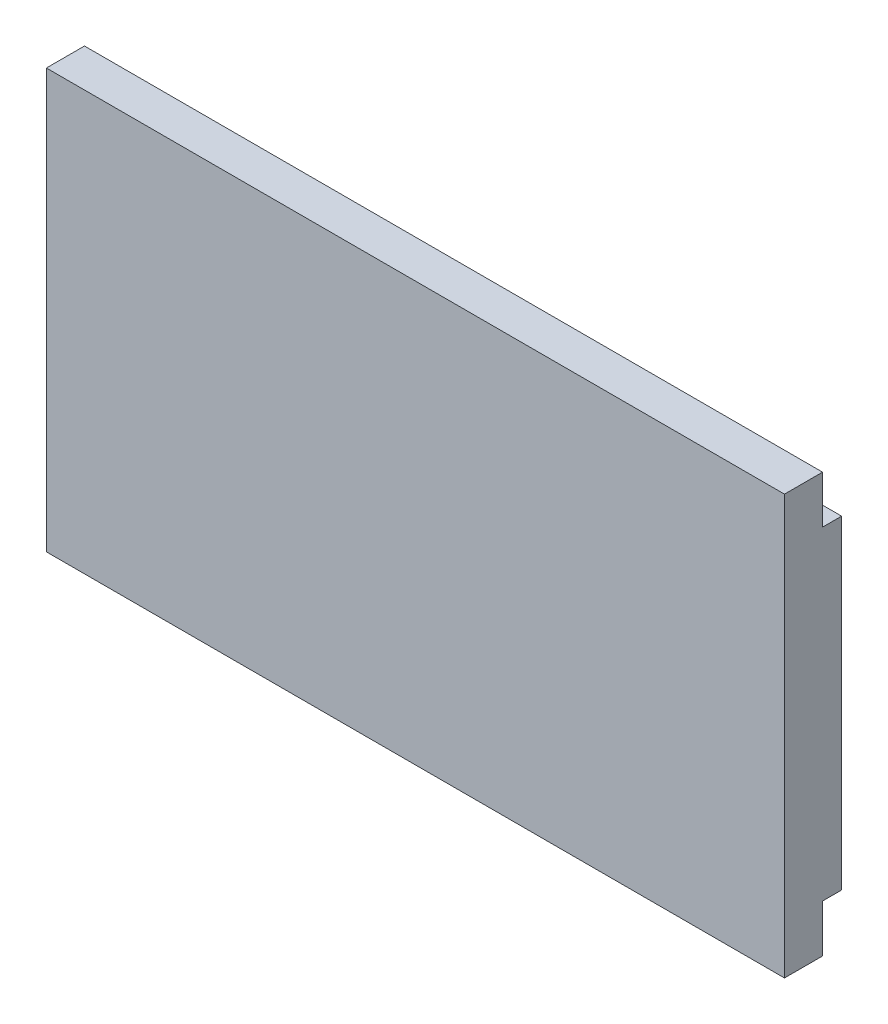
ISO-10303-21;
HEADER;
FILE_DESCRIPTION(('STEP AP214'),'2;1');
FILE_NAME('part.step','',(''),(''),'','','');
FILE_SCHEMA(('AUTOMOTIVE_DESIGN { 1 0 10303 214 1 1 1 1 }'));
ENDSEC;
DATA;
#1=APPLICATION_CONTEXT('core data for automotive mechanical design processes');
#2=APPLICATION_PROTOCOL_DEFINITION('international standard','automotive_design',2000,#1);
#3=PRODUCT_CONTEXT('',#1,'mechanical');
#4=PRODUCT('Part','Part','',(#3));
#5=PRODUCT_RELATED_PRODUCT_CATEGORY('part','',(#4));
#6=PRODUCT_DEFINITION_FORMATION('','',#4);
#7=PRODUCT_DEFINITION_CONTEXT('part definition',#1,'design');
#8=PRODUCT_DEFINITION('design','',#6,#7);
#9=PRODUCT_DEFINITION_SHAPE('','',#8);
#10=(LENGTH_UNIT() NAMED_UNIT(*) SI_UNIT(.MILLI.,.METRE.));
#11=(NAMED_UNIT(*) PLANE_ANGLE_UNIT() SI_UNIT($,.RADIAN.));
#12=(NAMED_UNIT(*) SI_UNIT($,.STERADIAN.) SOLID_ANGLE_UNIT());
#13=UNCERTAINTY_MEASURE_WITH_UNIT(LENGTH_MEASURE(1.E-05),#10,'distance_accuracy_value','');
#14=(GEOMETRIC_REPRESENTATION_CONTEXT(3) GLOBAL_UNCERTAINTY_ASSIGNED_CONTEXT((#13)) GLOBAL_UNIT_ASSIGNED_CONTEXT((#10,
#11,#12)) REPRESENTATION_CONTEXT('',''));
#15=CARTESIAN_POINT('',(0.,0.,0.));
#16=DIRECTION('',(0.,0.,1.));
#17=DIRECTION('',(1.,0.,0.));
#18=AXIS2_PLACEMENT_3D('',#15,#16,#17);
#19=CARTESIAN_POINT('',(0.,0.,0.));
#20=DIRECTION('',(0.,0.,1.));
#21=DIRECTION('',(1.,0.,0.));
#22=AXIS2_PLACEMENT_3D('',#19,#20,#21);
#23=PLANE('',#22);
#24=DIRECTION('',(0.,-1.,0.));
#25=VECTOR('',#24,1.);
#26=CARTESIAN_POINT('',(13.5,-8.8,0.));
#27=LINE('',#26,#25);
#28=CARTESIAN_POINT('',(13.5,-6.8,0.));
#29=VERTEX_POINT('',#28);
#30=CARTESIAN_POINT('',(13.5,-8.8,0.));
#31=VERTEX_POINT('',#30);
#32=EDGE_CURVE('E55',#29,#31,#27,.T.);
#33=ORIENTED_EDGE('',*,*,#32,.F.);
#34=DIRECTION('',(-1.,0.,0.));
#35=VECTOR('',#34,1.);
#36=CARTESIAN_POINT('',(13.5,-6.8,0.));
#37=LINE('',#36,#35);
#38=CARTESIAN_POINT('',(15.5,-6.8,0.));
#39=VERTEX_POINT('',#38);
#40=EDGE_CURVE('E264',#39,#29,#37,.T.);
#41=ORIENTED_EDGE('',*,*,#40,.F.);
#42=DIRECTION('',(0.,1.,0.));
#43=VECTOR('',#42,1.);
#44=CARTESIAN_POINT('',(15.5,8.8,0.));
#45=LINE('',#44,#43);
#46=CARTESIAN_POINT('',(15.5,-8.8,0.));
#47=VERTEX_POINT('',#46);
#48=EDGE_CURVE('E186',#47,#39,#45,.T.);
#49=ORIENTED_EDGE('',*,*,#48,.F.);
#50=DIRECTION('',(1.,0.,0.));
#51=VECTOR('',#50,1.);
#52=CARTESIAN_POINT('',(-15.5,-8.8,0.));
#53=LINE('',#52,#51);
#54=EDGE_CURVE('E216',#31,#47,#53,.T.);
#55=ORIENTED_EDGE('',*,*,#54,.F.);
#56=EDGE_LOOP('',(#33,#41,#49,#55));
#57=FACE_BOUND('',#56,.T.);
#58=ADVANCED_FACE('F39',(#57),#23,.F.);
#59=DIRECTION('',(1.,0.,0.));
#60=VECTOR('',#59,1.);
#61=CARTESIAN_POINT('',(15.5,6.8,0.));
#62=LINE('',#61,#60);
#63=CARTESIAN_POINT('',(0.999999999999999,6.8,0.));
#64=VERTEX_POINT('',#63);
#65=CARTESIAN_POINT('',(15.5,6.8,0.));
#66=VERTEX_POINT('',#65);
#67=EDGE_CURVE('E63',#64,#66,#62,.T.);
#68=ORIENTED_EDGE('',*,*,#67,.F.);
#69=DIRECTION('',(0.,1.,0.));
#70=VECTOR('',#69,1.);
#71=CARTESIAN_POINT('',(0.999999999999999,6.8,0.));
#72=LINE('',#71,#70);
#73=CARTESIAN_POINT('',(0.999999999999999,4.8,0.));
#74=VERTEX_POINT('',#73);
#75=EDGE_CURVE('E259',#74,#64,#72,.T.);
#76=ORIENTED_EDGE('',*,*,#75,.F.);
#77=DIRECTION('',(1.,0.,0.));
#78=VECTOR('',#77,1.);
#79=CARTESIAN_POINT('',(0.999999999999999,4.8,0.));
#80=LINE('',#79,#78);
#81=CARTESIAN_POINT('',(-3.,4.8,0.));
#82=VERTEX_POINT('',#81);
#83=EDGE_CURVE('E249',#82,#74,#80,.T.);
#84=ORIENTED_EDGE('',*,*,#83,.F.);
#85=DIRECTION('',(0.,-1.,0.));
#86=VECTOR('',#85,1.);
#87=CARTESIAN_POINT('',(-3.,4.8,0.));
#88=LINE('',#87,#86);
#89=CARTESIAN_POINT('',(-3.,6.73518386197479,0.));
#90=VERTEX_POINT('',#89);
#91=EDGE_CURVE('E240',#90,#82,#88,.T.);
#92=ORIENTED_EDGE('',*,*,#91,.F.);
#93=DIRECTION('',(1.,0.,0.));
#94=VECTOR('',#93,1.);
#95=CARTESIAN_POINT('',(-3.,6.73518386197479,0.));
#96=LINE('',#95,#94);
#97=CARTESIAN_POINT('',(-15.5,6.73518386197479,0.));
#98=VERTEX_POINT('',#97);
#99=EDGE_CURVE('E238',#98,#90,#96,.T.);
#100=ORIENTED_EDGE('',*,*,#99,.F.);
#101=DIRECTION('',(0.,-1.,0.));
#102=VECTOR('',#101,1.);
#103=CARTESIAN_POINT('',(-15.5,8.8,0.));
#104=LINE('',#103,#102);
#105=CARTESIAN_POINT('',(-15.5,8.8,0.));
#106=VERTEX_POINT('',#105);
#107=EDGE_CURVE('E212',#106,#98,#104,.T.);
#108=ORIENTED_EDGE('',*,*,#107,.F.);
#109=DIRECTION('',(-1.,0.,0.));
#110=VECTOR('',#109,1.);
#111=CARTESIAN_POINT('',(-15.5,8.8,0.));
#112=LINE('',#111,#110);
#113=CARTESIAN_POINT('',(15.5,8.8,0.));
#114=VERTEX_POINT('',#113);
#115=EDGE_CURVE('E208',#114,#106,#112,.T.);
#116=ORIENTED_EDGE('',*,*,#115,.F.);
#117=EDGE_CURVE('E182',#66,#114,#45,.T.);
#118=ORIENTED_EDGE('',*,*,#117,.F.);
#119=EDGE_LOOP('',(#68,#76,#84,#92,#100,#108,#116,#118));
#120=FACE_BOUND('',#119,.T.);
#121=ADVANCED_FACE('F236',(#120),#23,.F.);
#122=DIRECTION('',(-1.,0.,0.));
#123=VECTOR('',#122,1.);
#124=CARTESIAN_POINT('',(-15.5,-6.8,0.));
#125=LINE('',#124,#123);
#126=CARTESIAN_POINT('',(-13.5,-6.8,0.));
#127=VERTEX_POINT('',#126);
#128=CARTESIAN_POINT('',(-15.5,-6.8,0.));
#129=VERTEX_POINT('',#128);
#130=EDGE_CURVE('E245',#127,#129,#125,.T.);
#131=ORIENTED_EDGE('',*,*,#130,.F.);
#132=DIRECTION('',(0.,1.,0.));
#133=VECTOR('',#132,1.);
#134=CARTESIAN_POINT('',(-13.5,-6.8,0.));
#135=LINE('',#134,#133);
#136=CARTESIAN_POINT('',(-13.5,-8.8,0.));
#137=VERTEX_POINT('',#136);
#138=EDGE_CURVE('E252',#137,#127,#135,.T.);
#139=ORIENTED_EDGE('',*,*,#138,.F.);
#140=CARTESIAN_POINT('',(-15.5,-8.8,0.));
#141=VERTEX_POINT('',#140);
#142=EDGE_CURVE('E180',#141,#137,#53,.T.);
#143=ORIENTED_EDGE('',*,*,#142,.F.);
#144=EDGE_CURVE('E211',#129,#141,#104,.T.);
#145=ORIENTED_EDGE('',*,*,#144,.F.);
#146=EDGE_LOOP('',(#131,#139,#143,#145));
#147=FACE_BOUND('',#146,.T.);
#148=ADVANCED_FACE('F309',(#147),#23,.F.);
#149=CARTESIAN_POINT('',(15.5,8.8,1.6));
#150=DIRECTION('',(-1.,0.,0.));
#151=DIRECTION('',(0.,-1.,0.));
#152=AXIS2_PLACEMENT_3D('',#149,#150,#151);
#153=PLANE('',#152);
#154=ORIENTED_EDGE('',*,*,#48,.T.);
#155=DIRECTION('',(0.,0.,1.));
#156=VECTOR('',#155,1.);
#157=CARTESIAN_POINT('',(15.5,-6.8,-0.8));
#158=LINE('',#157,#156);
#159=CARTESIAN_POINT('',(15.5,-6.8,-0.8));
#160=VERTEX_POINT('',#159);
#161=EDGE_CURVE('E276',#160,#39,#158,.T.);
#162=ORIENTED_EDGE('',*,*,#161,.F.);
#163=DIRECTION('',(0.,-1.,0.));
#164=VECTOR('',#163,1.);
#165=CARTESIAN_POINT('',(15.5,-6.8,-0.8));
#166=LINE('',#165,#164);
#167=CARTESIAN_POINT('',(15.5,6.8,-0.8));
#168=VERTEX_POINT('',#167);
#169=EDGE_CURVE('E317',#168,#160,#166,.T.);
#170=ORIENTED_EDGE('',*,*,#169,.F.);
#171=DIRECTION('',(0.,0.,1.));
#172=VECTOR('',#171,1.);
#173=CARTESIAN_POINT('',(15.5,6.8,-0.8));
#174=LINE('',#173,#172);
#175=EDGE_CURVE('E280',#168,#66,#174,.T.);
#176=ORIENTED_EDGE('',*,*,#175,.T.);
#177=ORIENTED_EDGE('',*,*,#117,.T.);
#178=DIRECTION('',(0.,0.,-1.));
#179=VECTOR('',#178,1.);
#180=CARTESIAN_POINT('',(15.5,8.8,1.6));
#181=LINE('',#180,#179);
#182=CARTESIAN_POINT('',(15.5,8.8,1.6));
#183=VERTEX_POINT('',#182);
#184=EDGE_CURVE('E11',#183,#114,#181,.T.);
#185=ORIENTED_EDGE('',*,*,#184,.F.);
#186=DIRECTION('',(0.,1.,0.));
#187=VECTOR('',#186,1.);
#188=CARTESIAN_POINT('',(15.5,8.8,1.6));
#189=LINE('',#188,#187);
#190=CARTESIAN_POINT('',(15.5,-8.8,1.6));
#191=VERTEX_POINT('',#190);
#192=EDGE_CURVE('E192',#191,#183,#189,.T.);
#193=ORIENTED_EDGE('',*,*,#192,.F.);
#194=DIRECTION('',(0.,0.,-1.));
#195=VECTOR('',#194,1.);
#196=CARTESIAN_POINT('',(15.5,-8.8,1.6));
#197=LINE('',#196,#195);
#198=EDGE_CURVE('E204',#191,#47,#197,.T.);
#199=ORIENTED_EDGE('',*,*,#198,.T.);
#200=EDGE_LOOP('',(#154,#162,#170,#176,#177,#185,#193,#199));
#201=FACE_BOUND('',#200,.T.);
#202=ADVANCED_FACE('F41',(#201),#153,.F.);
#203=CARTESIAN_POINT('',(-15.5,8.8,1.6));
#204=DIRECTION('',(0.,-1.,0.));
#205=DIRECTION('',(0.,0.,-1.));
#206=AXIS2_PLACEMENT_3D('',#203,#204,#205);
#207=PLANE('',#206);
#208=ORIENTED_EDGE('',*,*,#115,.T.);
#209=DIRECTION('',(0.,0.,-1.));
#210=VECTOR('',#209,1.);
#211=CARTESIAN_POINT('',(-15.5,8.8,1.6));
#212=LINE('',#211,#210);
#213=CARTESIAN_POINT('',(-15.5,8.8,1.6));
#214=VERTEX_POINT('',#213);
#215=EDGE_CURVE('E48',#214,#106,#212,.T.);
#216=ORIENTED_EDGE('',*,*,#215,.F.);
#217=DIRECTION('',(-1.,0.,0.));
#218=VECTOR('',#217,1.);
#219=CARTESIAN_POINT('',(-15.5,8.8,1.6));
#220=LINE('',#219,#218);
#221=EDGE_CURVE('E196',#183,#214,#220,.T.);
#222=ORIENTED_EDGE('',*,*,#221,.F.);
#223=ORIENTED_EDGE('',*,*,#184,.T.);
#224=EDGE_LOOP('',(#208,#216,#222,#223));
#225=FACE_BOUND('',#224,.T.);
#226=ADVANCED_FACE('F382',(#225),#207,.F.);
#227=CARTESIAN_POINT('',(-15.5,8.8,1.6));
#228=DIRECTION('',(1.,0.,0.));
#229=DIRECTION('',(0.,1.,0.));
#230=AXIS2_PLACEMENT_3D('',#227,#228,#229);
#231=PLANE('',#230);
#232=ORIENTED_EDGE('',*,*,#107,.T.);
#233=DIRECTION('',(0.,0.,1.));
#234=VECTOR('',#233,1.);
#235=CARTESIAN_POINT('',(-15.5,6.73518386197479,-0.8));
#236=LINE('',#235,#234);
#237=CARTESIAN_POINT('',(-15.5,6.73518386197479,-0.8));
#238=VERTEX_POINT('',#237);
#239=EDGE_CURVE('E299',#238,#98,#236,.T.);
#240=ORIENTED_EDGE('',*,*,#239,.F.);
#241=DIRECTION('',(0.,1.,0.));
#242=VECTOR('',#241,1.);
#243=CARTESIAN_POINT('',(-15.5,6.73518386197479,-0.8));
#244=LINE('',#243,#242);
#245=CARTESIAN_POINT('',(-15.5,-6.8,-0.8));
#246=VERTEX_POINT('',#245);
#247=EDGE_CURVE('E305',#246,#238,#244,.T.);
#248=ORIENTED_EDGE('',*,*,#247,.F.);
#249=DIRECTION('',(0.,0.,1.));
#250=VECTOR('',#249,1.);
#251=CARTESIAN_POINT('',(-15.5,-6.8,-0.8));
#252=LINE('',#251,#250);
#253=EDGE_CURVE('E188',#246,#129,#252,.T.);
#254=ORIENTED_EDGE('',*,*,#253,.T.);
#255=ORIENTED_EDGE('',*,*,#144,.T.);
#256=DIRECTION('',(0.,0.,-1.));
#257=VECTOR('',#256,1.);
#258=CARTESIAN_POINT('',(-15.5,-8.8,1.6));
#259=LINE('',#258,#257);
#260=CARTESIAN_POINT('',(-15.5,-8.8,1.6));
#261=VERTEX_POINT('',#260);
#262=EDGE_CURVE('E222',#261,#141,#259,.T.);
#263=ORIENTED_EDGE('',*,*,#262,.F.);
#264=DIRECTION('',(0.,-1.,0.));
#265=VECTOR('',#264,1.);
#266=CARTESIAN_POINT('',(-15.5,8.8,1.6));
#267=LINE('',#266,#265);
#268=EDGE_CURVE('E199',#214,#261,#267,.T.);
#269=ORIENTED_EDGE('',*,*,#268,.F.);
#270=ORIENTED_EDGE('',*,*,#215,.T.);
#271=EDGE_LOOP('',(#232,#240,#248,#254,#255,#263,#269,#270));
#272=FACE_BOUND('',#271,.T.);
#273=ADVANCED_FACE('F230',(#272),#231,.F.);
#274=CARTESIAN_POINT('',(-15.5,-8.8,1.6));
#275=DIRECTION('',(0.,1.,0.));
#276=DIRECTION('',(0.,0.,1.));
#277=AXIS2_PLACEMENT_3D('',#274,#275,#276);
#278=PLANE('',#277);
#279=ORIENTED_EDGE('',*,*,#142,.T.);
#280=DIRECTION('',(0.,0.,1.));
#281=VECTOR('',#280,1.);
#282=CARTESIAN_POINT('',(-13.5,-8.8,-0.8));
#283=LINE('',#282,#281);
#284=CARTESIAN_POINT('',(-13.5,-8.8,-0.8));
#285=VERTEX_POINT('',#284);
#286=EDGE_CURVE('E158',#285,#137,#283,.T.);
#287=ORIENTED_EDGE('',*,*,#286,.F.);
#288=DIRECTION('',(-1.,0.,0.));
#289=VECTOR('',#288,1.);
#290=CARTESIAN_POINT('',(-13.5,-8.8,-0.8));
#291=LINE('',#290,#289);
#292=CARTESIAN_POINT('',(13.5,-8.8,-0.8));
#293=VERTEX_POINT('',#292);
#294=EDGE_CURVE('E165',#293,#285,#291,.T.);
#295=ORIENTED_EDGE('',*,*,#294,.F.);
#296=DIRECTION('',(0.,0.,1.));
#297=VECTOR('',#296,1.);
#298=CARTESIAN_POINT('',(13.5,-8.8,-0.8));
#299=LINE('',#298,#297);
#300=EDGE_CURVE('E269',#293,#31,#299,.T.);
#301=ORIENTED_EDGE('',*,*,#300,.T.);
#302=ORIENTED_EDGE('',*,*,#54,.T.);
#303=ORIENTED_EDGE('',*,*,#198,.F.);
#304=DIRECTION('',(1.,0.,0.));
#305=VECTOR('',#304,1.);
#306=CARTESIAN_POINT('',(-15.5,-8.8,1.6));
#307=LINE('',#306,#305);
#308=EDGE_CURVE('E202',#261,#191,#307,.T.);
#309=ORIENTED_EDGE('',*,*,#308,.F.);
#310=ORIENTED_EDGE('',*,*,#262,.T.);
#311=EDGE_LOOP('',(#279,#287,#295,#301,#302,#303,#309,#310));
#312=FACE_BOUND('',#311,.T.);
#313=ADVANCED_FACE('F177',(#312),#278,.F.);
#314=CARTESIAN_POINT('',(0.,0.,1.6));
#315=DIRECTION('',(0.,0.,1.));
#316=DIRECTION('',(1.,0.,0.));
#317=AXIS2_PLACEMENT_3D('',#314,#315,#316);
#318=PLANE('',#317);
#319=ORIENTED_EDGE('',*,*,#192,.T.);
#320=ORIENTED_EDGE('',*,*,#221,.T.);
#321=ORIENTED_EDGE('',*,*,#268,.T.);
#322=ORIENTED_EDGE('',*,*,#308,.T.);
#323=EDGE_LOOP('',(#319,#320,#321,#322));
#324=FACE_BOUND('',#323,.T.);
#325=ADVANCED_FACE('F391',(#324),#318,.T.);
#326=CARTESIAN_POINT('',(-13.5,-6.8,-0.8));
#327=DIRECTION('',(1.,0.,0.));
#328=DIRECTION('',(0.,0.,-1.));
#329=AXIS2_PLACEMENT_3D('',#326,#327,#328);
#330=PLANE('',#329);
#331=ORIENTED_EDGE('',*,*,#138,.T.);
#332=DIRECTION('',(0.,0.,1.));
#333=VECTOR('',#332,1.);
#334=CARTESIAN_POINT('',(-13.5,-6.8,-0.8));
#335=LINE('',#334,#333);
#336=CARTESIAN_POINT('',(-13.5,-6.8,-0.8));
#337=VERTEX_POINT('',#336);
#338=EDGE_CURVE('E160',#337,#127,#335,.T.);
#339=ORIENTED_EDGE('',*,*,#338,.F.);
#340=DIRECTION('',(0.,1.,0.));
#341=VECTOR('',#340,1.);
#342=CARTESIAN_POINT('',(-13.5,-6.8,-0.8));
#343=LINE('',#342,#341);
#344=EDGE_CURVE('E153',#285,#337,#343,.T.);
#345=ORIENTED_EDGE('',*,*,#344,.F.);
#346=ORIENTED_EDGE('',*,*,#286,.T.);
#347=EDGE_LOOP('',(#331,#339,#345,#346));
#348=FACE_BOUND('',#347,.T.);
#349=ADVANCED_FACE('F156',(#348),#330,.F.);
#350=CARTESIAN_POINT('',(-15.5,-6.8,-0.8));
#351=DIRECTION('',(0.,1.,0.));
#352=DIRECTION('',(0.,0.,1.));
#353=AXIS2_PLACEMENT_3D('',#350,#351,#352);
#354=PLANE('',#353);
#355=ORIENTED_EDGE('',*,*,#130,.T.);
#356=ORIENTED_EDGE('',*,*,#253,.F.);
#357=DIRECTION('',(-1.,0.,0.));
#358=VECTOR('',#357,1.);
#359=CARTESIAN_POINT('',(-15.5,-6.8,-0.8));
#360=LINE('',#359,#358);
#361=EDGE_CURVE('E164',#337,#246,#360,.T.);
#362=ORIENTED_EDGE('',*,*,#361,.F.);
#363=ORIENTED_EDGE('',*,*,#338,.T.);
#364=EDGE_LOOP('',(#355,#356,#362,#363));
#365=FACE_BOUND('',#364,.T.);
#366=ADVANCED_FACE('F307',(#365),#354,.F.);
#367=CARTESIAN_POINT('',(-3.,6.73518386197479,-0.8));
#368=DIRECTION('',(0.,-1.,0.));
#369=DIRECTION('',(0.,0.,-1.));
#370=AXIS2_PLACEMENT_3D('',#367,#368,#369);
#371=PLANE('',#370);
#372=ORIENTED_EDGE('',*,*,#99,.T.);
#373=DIRECTION('',(0.,0.,1.));
#374=VECTOR('',#373,1.);
#375=CARTESIAN_POINT('',(-3.,6.73518386197479,-0.8));
#376=LINE('',#375,#374);
#377=CARTESIAN_POINT('',(-3.,6.73518386197479,-0.8));
#378=VERTEX_POINT('',#377);
#379=EDGE_CURVE('E296',#378,#90,#376,.T.);
#380=ORIENTED_EDGE('',*,*,#379,.F.);
#381=DIRECTION('',(1.,0.,0.));
#382=VECTOR('',#381,1.);
#383=CARTESIAN_POINT('',(-3.,6.73518386197479,-0.8));
#384=LINE('',#383,#382);
#385=EDGE_CURVE('E332',#238,#378,#384,.T.);
#386=ORIENTED_EDGE('',*,*,#385,.F.);
#387=ORIENTED_EDGE('',*,*,#239,.T.);
#388=EDGE_LOOP('',(#372,#380,#386,#387));
#389=FACE_BOUND('',#388,.T.);
#390=ADVANCED_FACE('F339',(#389),#371,.F.);
#391=CARTESIAN_POINT('',(-3.,4.8,-0.8));
#392=DIRECTION('',(-1.,0.,0.));
#393=DIRECTION('',(0.,0.,1.));
#394=AXIS2_PLACEMENT_3D('',#391,#392,#393);
#395=PLANE('',#394);
#396=ORIENTED_EDGE('',*,*,#91,.T.);
#397=DIRECTION('',(0.,0.,1.));
#398=VECTOR('',#397,1.);
#399=CARTESIAN_POINT('',(-3.,4.8,-0.8));
#400=LINE('',#399,#398);
#401=CARTESIAN_POINT('',(-3.,4.8,-0.8));
#402=VERTEX_POINT('',#401);
#403=EDGE_CURVE('E292',#402,#82,#400,.T.);
#404=ORIENTED_EDGE('',*,*,#403,.F.);
#405=DIRECTION('',(0.,-1.,0.));
#406=VECTOR('',#405,1.);
#407=CARTESIAN_POINT('',(-3.,4.8,-0.8));
#408=LINE('',#407,#406);
#409=EDGE_CURVE('E329',#378,#402,#408,.T.);
#410=ORIENTED_EDGE('',*,*,#409,.F.);
#411=ORIENTED_EDGE('',*,*,#379,.T.);
#412=EDGE_LOOP('',(#396,#404,#410,#411));
#413=FACE_BOUND('',#412,.T.);
#414=ADVANCED_FACE('F343',(#413),#395,.F.);
#415=CARTESIAN_POINT('',(0.999999999999999,4.8,-0.8));
#416=DIRECTION('',(0.,-1.,0.));
#417=DIRECTION('',(0.,0.,-1.));
#418=AXIS2_PLACEMENT_3D('',#415,#416,#417);
#419=PLANE('',#418);
#420=ORIENTED_EDGE('',*,*,#83,.T.);
#421=DIRECTION('',(0.,0.,1.));
#422=VECTOR('',#421,1.);
#423=CARTESIAN_POINT('',(0.999999999999999,4.8,-0.8));
#424=LINE('',#423,#422);
#425=CARTESIAN_POINT('',(0.999999999999999,4.8,-0.8));
#426=VERTEX_POINT('',#425);
#427=EDGE_CURVE('E288',#426,#74,#424,.T.);
#428=ORIENTED_EDGE('',*,*,#427,.F.);
#429=DIRECTION('',(1.,0.,0.));
#430=VECTOR('',#429,1.);
#431=CARTESIAN_POINT('',(0.999999999999999,4.8,-0.8));
#432=LINE('',#431,#430);
#433=EDGE_CURVE('E326',#402,#426,#432,.T.);
#434=ORIENTED_EDGE('',*,*,#433,.F.);
#435=ORIENTED_EDGE('',*,*,#403,.T.);
#436=EDGE_LOOP('',(#420,#428,#434,#435));
#437=FACE_BOUND('',#436,.T.);
#438=ADVANCED_FACE('F349',(#437),#419,.F.);
#439=CARTESIAN_POINT('',(0.999999999999999,6.8,-0.8));
#440=DIRECTION('',(1.,0.,0.));
#441=DIRECTION('',(0.,0.,-1.));
#442=AXIS2_PLACEMENT_3D('',#439,#440,#441);
#443=PLANE('',#442);
#444=ORIENTED_EDGE('',*,*,#75,.T.);
#445=DIRECTION('',(0.,0.,1.));
#446=VECTOR('',#445,1.);
#447=CARTESIAN_POINT('',(0.999999999999999,6.8,-0.8));
#448=LINE('',#447,#446);
#449=CARTESIAN_POINT('',(0.999999999999999,6.8,-0.8));
#450=VERTEX_POINT('',#449);
#451=EDGE_CURVE('E284',#450,#64,#448,.T.);
#452=ORIENTED_EDGE('',*,*,#451,.F.);
#453=DIRECTION('',(0.,1.,0.));
#454=VECTOR('',#453,1.);
#455=CARTESIAN_POINT('',(0.999999999999999,6.8,-0.8));
#456=LINE('',#455,#454);
#457=EDGE_CURVE('E323',#426,#450,#456,.T.);
#458=ORIENTED_EDGE('',*,*,#457,.F.);
#459=ORIENTED_EDGE('',*,*,#427,.T.);
#460=EDGE_LOOP('',(#444,#452,#458,#459));
#461=FACE_BOUND('',#460,.T.);
#462=ADVANCED_FACE('F351',(#461),#443,.F.);
#463=CARTESIAN_POINT('',(15.5,6.8,-0.8));
#464=DIRECTION('',(0.,-1.,0.));
#465=DIRECTION('',(0.,0.,-1.));
#466=AXIS2_PLACEMENT_3D('',#463,#464,#465);
#467=PLANE('',#466);
#468=ORIENTED_EDGE('',*,*,#67,.T.);
#469=ORIENTED_EDGE('',*,*,#175,.F.);
#470=DIRECTION('',(1.,0.,0.));
#471=VECTOR('',#470,1.);
#472=CARTESIAN_POINT('',(15.5,6.8,-0.8));
#473=LINE('',#472,#471);
#474=EDGE_CURVE('E320',#450,#168,#473,.T.);
#475=ORIENTED_EDGE('',*,*,#474,.F.);
#476=ORIENTED_EDGE('',*,*,#451,.T.);
#477=EDGE_LOOP('',(#468,#469,#475,#476));
#478=FACE_BOUND('',#477,.T.);
#479=ADVANCED_FACE('F355',(#478),#467,.F.);
#480=CARTESIAN_POINT('',(13.5,-6.8,-0.8));
#481=DIRECTION('',(0.,1.,0.));
#482=DIRECTION('',(0.,0.,1.));
#483=AXIS2_PLACEMENT_3D('',#480,#481,#482);
#484=PLANE('',#483);
#485=ORIENTED_EDGE('',*,*,#40,.T.);
#486=DIRECTION('',(0.,0.,1.));
#487=VECTOR('',#486,1.);
#488=CARTESIAN_POINT('',(13.5,-6.8,-0.8));
#489=LINE('',#488,#487);
#490=CARTESIAN_POINT('',(13.5,-6.8,-0.8));
#491=VERTEX_POINT('',#490);
#492=EDGE_CURVE('E272',#491,#29,#489,.T.);
#493=ORIENTED_EDGE('',*,*,#492,.F.);
#494=DIRECTION('',(-1.,0.,0.));
#495=VECTOR('',#494,1.);
#496=CARTESIAN_POINT('',(13.5,-6.8,-0.8));
#497=LINE('',#496,#495);
#498=EDGE_CURVE('E314',#160,#491,#497,.T.);
#499=ORIENTED_EDGE('',*,*,#498,.F.);
#500=ORIENTED_EDGE('',*,*,#161,.T.);
#501=EDGE_LOOP('',(#485,#493,#499,#500));
#502=FACE_BOUND('',#501,.T.);
#503=ADVANCED_FACE('F363',(#502),#484,.F.);
#504=CARTESIAN_POINT('',(13.5,-8.8,-0.8));
#505=DIRECTION('',(-1.,0.,0.));
#506=DIRECTION('',(0.,0.,1.));
#507=AXIS2_PLACEMENT_3D('',#504,#505,#506);
#508=PLANE('',#507);
#509=ORIENTED_EDGE('',*,*,#32,.T.);
#510=ORIENTED_EDGE('',*,*,#300,.F.);
#511=DIRECTION('',(0.,-1.,0.));
#512=VECTOR('',#511,1.);
#513=CARTESIAN_POINT('',(13.5,-8.8,-0.8));
#514=LINE('',#513,#512);
#515=EDGE_CURVE('E170',#491,#293,#514,.T.);
#516=ORIENTED_EDGE('',*,*,#515,.F.);
#517=ORIENTED_EDGE('',*,*,#492,.T.);
#518=EDGE_LOOP('',(#509,#510,#516,#517));
#519=FACE_BOUND('',#518,.T.);
#520=ADVANCED_FACE('F365',(#519),#508,.F.);
#521=CARTESIAN_POINT('',(0.,0.,-0.8));
#522=DIRECTION('',(0.,0.,1.));
#523=DIRECTION('',(1.,0.,0.));
#524=AXIS2_PLACEMENT_3D('',#521,#522,#523);
#525=PLANE('',#524);
#526=ORIENTED_EDGE('',*,*,#294,.T.);
#527=ORIENTED_EDGE('',*,*,#344,.T.);
#528=ORIENTED_EDGE('',*,*,#361,.T.);
#529=ORIENTED_EDGE('',*,*,#247,.T.);
#530=ORIENTED_EDGE('',*,*,#385,.T.);
#531=ORIENTED_EDGE('',*,*,#409,.T.);
#532=ORIENTED_EDGE('',*,*,#433,.T.);
#533=ORIENTED_EDGE('',*,*,#457,.T.);
#534=ORIENTED_EDGE('',*,*,#474,.T.);
#535=ORIENTED_EDGE('',*,*,#169,.T.);
#536=ORIENTED_EDGE('',*,*,#498,.T.);
#537=ORIENTED_EDGE('',*,*,#515,.T.);
#538=EDGE_LOOP('',(#526,#527,#528,#529,#530,#531,#532,#533,#534,#535,#536,#537));
#539=FACE_BOUND('',#538,.T.);
#540=ADVANCED_FACE('F168',(#539),#525,.F.);
#541=CLOSED_SHELL('',(#58,#121,#148,#202,#226,#273,#313,#325,#349,#366,#390,#414,#438,#462,#479,
#503,#520,#540));
#542=MANIFOLD_SOLID_BREP('B2',#541);
#543=ADVANCED_BREP_SHAPE_REPRESENTATION('',(#18,#542),#14);
#544=SHAPE_DEFINITION_REPRESENTATION(#9,#543);
ENDSEC;
END-ISO-10303-21;
